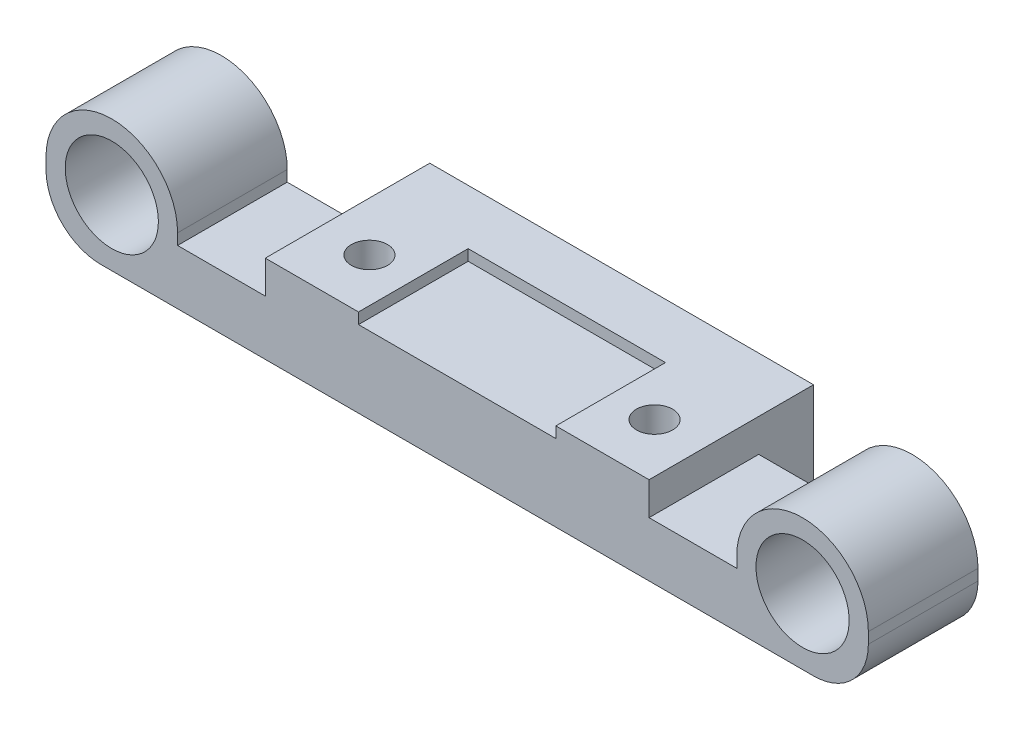
ISO-10303-21;
HEADER;
FILE_DESCRIPTION(('STEP AP214'),'2;1');
FILE_NAME('part.step','',(''),(''),'','','');
FILE_SCHEMA(('AUTOMOTIVE_DESIGN { 1 0 10303 214 1 1 1 1 }'));
ENDSEC;
DATA;
#1=APPLICATION_CONTEXT('core data for automotive mechanical design processes');
#2=APPLICATION_PROTOCOL_DEFINITION('international standard','automotive_design',2000,#1);
#3=PRODUCT_CONTEXT('',#1,'mechanical');
#4=PRODUCT('Part','Part','',(#3));
#5=PRODUCT_RELATED_PRODUCT_CATEGORY('part','',(#4));
#6=PRODUCT_DEFINITION_FORMATION('','',#4);
#7=PRODUCT_DEFINITION_CONTEXT('part definition',#1,'design');
#8=PRODUCT_DEFINITION('design','',#6,#7);
#9=PRODUCT_DEFINITION_SHAPE('','',#8);
#10=(LENGTH_UNIT() NAMED_UNIT(*) SI_UNIT(.MILLI.,.METRE.));
#11=(NAMED_UNIT(*) PLANE_ANGLE_UNIT() SI_UNIT($,.RADIAN.));
#12=(NAMED_UNIT(*) SI_UNIT($,.STERADIAN.) SOLID_ANGLE_UNIT());
#13=UNCERTAINTY_MEASURE_WITH_UNIT(LENGTH_MEASURE(1.E-05),#10,'distance_accuracy_value','');
#14=(GEOMETRIC_REPRESENTATION_CONTEXT(3) GLOBAL_UNCERTAINTY_ASSIGNED_CONTEXT((#13)) GLOBAL_UNIT_ASSIGNED_CONTEXT((#10,
#11,#12)) REPRESENTATION_CONTEXT('',''));
#15=CARTESIAN_POINT('',(0.,0.,0.));
#16=DIRECTION('',(0.,0.,1.));
#17=DIRECTION('',(1.,0.,0.));
#18=AXIS2_PLACEMENT_3D('',#15,#16,#17);
#19=CARTESIAN_POINT('',(17.5,8.,24.375));
#20=DIRECTION('',(-1.,0.,0.));
#21=DIRECTION('',(0.,0.,1.));
#22=AXIS2_PLACEMENT_3D('',#19,#20,#21);
#23=PLANE('',#22);
#24=DIRECTION('',(0.,0.,1.));
#25=VECTOR('',#24,1.);
#26=CARTESIAN_POINT('',(17.5,4.99999999999999,14.375));
#27=LINE('',#26,#25);
#28=CARTESIAN_POINT('',(17.5,4.99999999999999,14.375));
#29=VERTEX_POINT('',#28);
#30=CARTESIAN_POINT('',(17.5,4.99999999999999,24.375));
#31=VERTEX_POINT('',#30);
#32=EDGE_CURVE('E226',#29,#31,#27,.T.);
#33=ORIENTED_EDGE('',*,*,#32,.F.);
#34=DIRECTION('',(0.,-1.,0.));
#35=VECTOR('',#34,1.);
#36=CARTESIAN_POINT('',(17.5,4.99999999999999,14.375));
#37=LINE('',#36,#35);
#38=CARTESIAN_POINT('',(17.5,0.,14.375));
#39=VERTEX_POINT('',#38);
#40=EDGE_CURVE('E211',#29,#39,#37,.T.);
#41=ORIENTED_EDGE('',*,*,#40,.T.);
#42=DIRECTION('',(0.,0.,-1.));
#43=VECTOR('',#42,1.);
#44=CARTESIAN_POINT('',(17.5,0.,24.375));
#45=LINE('',#44,#43);
#46=CARTESIAN_POINT('',(17.5,0.,9.375));
#47=VERTEX_POINT('',#46);
#48=EDGE_CURVE('E331',#39,#47,#45,.T.);
#49=ORIENTED_EDGE('',*,*,#48,.T.);
#50=DIRECTION('',(0.,-1.,0.));
#51=VECTOR('',#50,1.);
#52=CARTESIAN_POINT('',(17.5,8.,9.375));
#53=LINE('',#52,#51);
#54=CARTESIAN_POINT('',(17.5,8.,9.375));
#55=VERTEX_POINT('',#54);
#56=EDGE_CURVE('E343',#55,#47,#53,.T.);
#57=ORIENTED_EDGE('',*,*,#56,.F.);
#58=DIRECTION('',(0.,0.,-1.));
#59=VECTOR('',#58,1.);
#60=CARTESIAN_POINT('',(17.5,8.,24.375));
#61=LINE('',#60,#59);
#62=CARTESIAN_POINT('',(17.5,8.,24.375));
#63=VERTEX_POINT('',#62);
#64=EDGE_CURVE('E320',#63,#55,#61,.T.);
#65=ORIENTED_EDGE('',*,*,#64,.F.);
#66=DIRECTION('',(0.,-1.,0.));
#67=VECTOR('',#66,1.);
#68=CARTESIAN_POINT('',(17.5,8.,24.375));
#69=LINE('',#68,#67);
#70=EDGE_CURVE('E340',#63,#31,#69,.T.);
#71=ORIENTED_EDGE('',*,*,#70,.T.);
#72=EDGE_LOOP('',(#33,#41,#49,#57,#65,#71));
#73=FACE_BOUND('',#72,.T.);
#74=ADVANCED_FACE('F39',(#73),#23,.F.);
#75=CARTESIAN_POINT('',(-17.5,8.,24.375));
#76=DIRECTION('',(-1.,0.,0.));
#77=DIRECTION('',(0.,0.,1.));
#78=AXIS2_PLACEMENT_3D('',#75,#76,#77);
#79=PLANE('',#78);
#80=DIRECTION('',(0.,0.,-1.));
#81=VECTOR('',#80,1.);
#82=CARTESIAN_POINT('',(-17.5,0.,24.375));
#83=LINE('',#82,#81);
#84=CARTESIAN_POINT('',(-17.5,0.,14.375));
#85=VERTEX_POINT('',#84);
#86=CARTESIAN_POINT('',(-17.5,0.,9.375));
#87=VERTEX_POINT('',#86);
#88=EDGE_CURVE('E303',#85,#87,#83,.T.);
#89=ORIENTED_EDGE('',*,*,#88,.F.);
#90=DIRECTION('',(0.,1.,0.));
#91=VECTOR('',#90,1.);
#92=CARTESIAN_POINT('',(-17.5,5.,14.375));
#93=LINE('',#92,#91);
#94=CARTESIAN_POINT('',(-17.5,5.,14.375));
#95=VERTEX_POINT('',#94);
#96=EDGE_CURVE('E229',#85,#95,#93,.T.);
#97=ORIENTED_EDGE('',*,*,#96,.T.);
#98=DIRECTION('',(0.,0.,1.));
#99=VECTOR('',#98,1.);
#100=CARTESIAN_POINT('',(-17.5,5.,14.375));
#101=LINE('',#100,#99);
#102=CARTESIAN_POINT('',(-17.5,5.,24.375));
#103=VERTEX_POINT('',#102);
#104=EDGE_CURVE('E246',#95,#103,#101,.T.);
#105=ORIENTED_EDGE('',*,*,#104,.T.);
#106=DIRECTION('',(0.,-1.,0.));
#107=VECTOR('',#106,1.);
#108=CARTESIAN_POINT('',(-17.5,8.,24.375));
#109=LINE('',#108,#107);
#110=CARTESIAN_POINT('',(-17.5,8.,24.375));
#111=VERTEX_POINT('',#110);
#112=EDGE_CURVE('E336',#111,#103,#109,.T.);
#113=ORIENTED_EDGE('',*,*,#112,.F.);
#114=DIRECTION('',(0.,0.,-1.));
#115=VECTOR('',#114,1.);
#116=CARTESIAN_POINT('',(-17.5,8.,24.375));
#117=LINE('',#116,#115);
#118=CARTESIAN_POINT('',(-17.5,8.,9.375));
#119=VERTEX_POINT('',#118);
#120=EDGE_CURVE('E314',#111,#119,#117,.T.);
#121=ORIENTED_EDGE('',*,*,#120,.T.);
#122=DIRECTION('',(0.,-1.,0.));
#123=VECTOR('',#122,1.);
#124=CARTESIAN_POINT('',(-17.5,8.,9.375));
#125=LINE('',#124,#123);
#126=EDGE_CURVE('E327',#119,#87,#125,.T.);
#127=ORIENTED_EDGE('',*,*,#126,.T.);
#128=EDGE_LOOP('',(#89,#97,#105,#113,#121,#127));
#129=FACE_BOUND('',#128,.T.);
#130=ADVANCED_FACE('F386',(#129),#79,.T.);
#131=CARTESIAN_POINT('',(0.,8.,0.));
#132=DIRECTION('',(0.,-1.,0.));
#133=DIRECTION('',(0.,0.,-1.));
#134=AXIS2_PLACEMENT_3D('',#131,#132,#133);
#135=PLANE('',#134);
#136=ORIENTED_EDGE('',*,*,#64,.T.);
#137=DIRECTION('',(1.,0.,0.));
#138=VECTOR('',#137,1.);
#139=CARTESIAN_POINT('',(-17.5,8.,9.375));
#140=LINE('',#139,#138);
#141=EDGE_CURVE('E317',#119,#55,#140,.T.);
#142=ORIENTED_EDGE('',*,*,#141,.F.);
#143=ORIENTED_EDGE('',*,*,#120,.F.);
#144=DIRECTION('',(1.,0.,0.));
#145=VECTOR('',#144,1.);
#146=CARTESIAN_POINT('',(-17.5,8.,24.375));
#147=LINE('',#146,#145);
#148=CARTESIAN_POINT('',(-9.,8.,24.375));
#149=VERTEX_POINT('',#148);
#150=EDGE_CURVE('E324',#111,#149,#147,.T.);
#151=ORIENTED_EDGE('',*,*,#150,.T.);
#152=DIRECTION('',(0.,0.,1.));
#153=VECTOR('',#152,1.);
#154=CARTESIAN_POINT('',(-9.,8.,14.375));
#155=LINE('',#154,#153);
#156=CARTESIAN_POINT('',(-9.,8.,14.375));
#157=VERTEX_POINT('',#156);
#158=EDGE_CURVE('E259',#157,#149,#155,.T.);
#159=ORIENTED_EDGE('',*,*,#158,.F.);
#160=DIRECTION('',(-1.,0.,0.));
#161=VECTOR('',#160,1.);
#162=CARTESIAN_POINT('',(-9.,8.,14.375));
#163=LINE('',#162,#161);
#164=CARTESIAN_POINT('',(9.,8.,14.375));
#165=VERTEX_POINT('',#164);
#166=EDGE_CURVE('E269',#165,#157,#163,.T.);
#167=ORIENTED_EDGE('',*,*,#166,.F.);
#168=DIRECTION('',(0.,0.,-1.));
#169=VECTOR('',#168,1.);
#170=CARTESIAN_POINT('',(9.,8.,14.375));
#171=LINE('',#170,#169);
#172=CARTESIAN_POINT('',(9.,8.,24.375));
#173=VERTEX_POINT('',#172);
#174=EDGE_CURVE('E280',#173,#165,#171,.T.);
#175=ORIENTED_EDGE('',*,*,#174,.F.);
#176=EDGE_CURVE('E323',#173,#63,#147,.T.);
#177=ORIENTED_EDGE('',*,*,#176,.T.);
#178=EDGE_LOOP('',(#136,#142,#143,#151,#159,#167,#175,#177));
#179=FACE_BOUND('',#178,.T.);
#180=CARTESIAN_POINT('',(-13.,8.,19.375));
#181=DIRECTION('',(0.,-1.,0.));
#182=DIRECTION('',(0.,0.,-1.));
#183=AXIS2_PLACEMENT_3D('',#180,#181,#182);
#184=CIRCLE('',#183,1.65);
#185=CARTESIAN_POINT('',(-13.,8.,17.725));
#186=VERTEX_POINT('',#185);
#187=EDGE_CURVE('E294',#186,#186,#184,.T.);
#188=ORIENTED_EDGE('',*,*,#187,.T.);
#189=EDGE_LOOP('',(#188));
#190=FACE_BOUND('',#189,.T.);
#191=CARTESIAN_POINT('',(13.,8.,19.375));
#192=DIRECTION('',(0.,-1.,0.));
#193=DIRECTION('',(0.,0.,-1.));
#194=AXIS2_PLACEMENT_3D('',#191,#192,#193);
#195=CIRCLE('',#194,1.65);
#196=CARTESIAN_POINT('',(13.,8.,17.725));
#197=VERTEX_POINT('',#196);
#198=EDGE_CURVE('E287',#197,#197,#195,.T.);
#199=ORIENTED_EDGE('',*,*,#198,.T.);
#200=EDGE_LOOP('',(#199));
#201=FACE_BOUND('',#200,.T.);
#202=ADVANCED_FACE('F406',(#179,#190,#201),#135,.F.);
#203=CARTESIAN_POINT('',(0.,0.,0.));
#204=DIRECTION('',(0.,-1.,0.));
#205=DIRECTION('',(0.,0.,-1.));
#206=AXIS2_PLACEMENT_3D('',#203,#204,#205);
#207=PLANE('',#206);
#208=DIRECTION('',(1.,0.,0.));
#209=VECTOR('',#208,1.);
#210=CARTESIAN_POINT('',(-17.5,0.,9.375));
#211=LINE('',#210,#209);
#212=EDGE_CURVE('E329',#87,#47,#211,.T.);
#213=ORIENTED_EDGE('',*,*,#212,.T.);
#214=ORIENTED_EDGE('',*,*,#48,.F.);
#215=DIRECTION('',(1.,0.,0.));
#216=VECTOR('',#215,1.);
#217=CARTESIAN_POINT('',(17.5,0.,14.375));
#218=LINE('',#217,#216);
#219=CARTESIAN_POINT('',(32.5,0.,14.375));
#220=VERTEX_POINT('',#219);
#221=EDGE_CURVE('E214',#39,#220,#218,.T.);
#222=ORIENTED_EDGE('',*,*,#221,.T.);
#223=DIRECTION('',(0.,0.,1.));
#224=VECTOR('',#223,1.);
#225=CARTESIAN_POINT('',(32.5,0.,0.));
#226=LINE('',#225,#224);
#227=CARTESIAN_POINT('',(32.5,0.,24.375));
#228=VERTEX_POINT('',#227);
#229=EDGE_CURVE('E353',#220,#228,#226,.T.);
#230=ORIENTED_EDGE('',*,*,#229,.T.);
#231=DIRECTION('',(1.,0.,0.));
#232=VECTOR('',#231,1.);
#233=CARTESIAN_POINT('',(-17.5,0.,24.375));
#234=LINE('',#233,#232);
#235=CARTESIAN_POINT('',(-32.5,0.,24.375));
#236=VERTEX_POINT('',#235);
#237=EDGE_CURVE('E318',#236,#228,#234,.T.);
#238=ORIENTED_EDGE('',*,*,#237,.F.);
#239=DIRECTION('',(0.,0.,1.));
#240=VECTOR('',#239,1.);
#241=CARTESIAN_POINT('',(-32.5,0.,0.));
#242=LINE('',#241,#240);
#243=CARTESIAN_POINT('',(-32.5,0.,14.375));
#244=VERTEX_POINT('',#243);
#245=EDGE_CURVE('E339',#236,#244,#242,.F.);
#246=ORIENTED_EDGE('',*,*,#245,.T.);
#247=DIRECTION('',(1.,0.,0.));
#248=VECTOR('',#247,1.);
#249=CARTESIAN_POINT('',(-17.5,0.,14.375));
#250=LINE('',#249,#248);
#251=EDGE_CURVE('E244',#244,#85,#250,.T.);
#252=ORIENTED_EDGE('',*,*,#251,.T.);
#253=ORIENTED_EDGE('',*,*,#88,.T.);
#254=EDGE_LOOP('',(#213,#214,#222,#230,#238,#246,#252,#253));
#255=FACE_BOUND('',#254,.T.);
#256=CARTESIAN_POINT('',(-13.,0.,19.375));
#257=DIRECTION('',(0.,-1.,0.));
#258=DIRECTION('',(0.,0.,-1.));
#259=AXIS2_PLACEMENT_3D('',#256,#257,#258);
#260=CIRCLE('',#259,3.);
#261=CARTESIAN_POINT('',(-13.,0.,16.375));
#262=VERTEX_POINT('',#261);
#263=EDGE_CURVE('E304',#262,#262,#260,.T.);
#264=ORIENTED_EDGE('',*,*,#263,.F.);
#265=EDGE_LOOP('',(#264));
#266=FACE_BOUND('',#265,.T.);
#267=CARTESIAN_POINT('',(13.,0.,19.375));
#268=DIRECTION('',(0.,-1.,0.));
#269=DIRECTION('',(0.,0.,-1.));
#270=AXIS2_PLACEMENT_3D('',#267,#268,#269);
#271=CIRCLE('',#270,3.);
#272=CARTESIAN_POINT('',(13.,0.,16.375));
#273=VERTEX_POINT('',#272);
#274=EDGE_CURVE('E307',#273,#273,#271,.T.);
#275=ORIENTED_EDGE('',*,*,#274,.F.);
#276=EDGE_LOOP('',(#275));
#277=FACE_BOUND('',#276,.T.);
#278=ADVANCED_FACE('F389',(#255,#266,#277),#207,.T.);
#279=CARTESIAN_POINT('',(-17.5,8.,24.375));
#280=DIRECTION('',(0.,0.,-1.));
#281=DIRECTION('',(-1.,0.,0.));
#282=AXIS2_PLACEMENT_3D('',#279,#280,#281);
#283=PLANE('',#282);
#284=CARTESIAN_POINT('',(-31.5,6.,24.375));
#285=DIRECTION('',(0.,0.,1.));
#286=DIRECTION('',(1.,0.,0.));
#287=AXIS2_PLACEMENT_3D('',#284,#285,#286);
#288=CIRCLE('',#287,4.25000000000001);
#289=CARTESIAN_POINT('',(-27.25,6.,24.375));
#290=VERTEX_POINT('',#289);
#291=EDGE_CURVE('E430',#290,#290,#288,.T.);
#292=ORIENTED_EDGE('',*,*,#291,.F.);
#293=EDGE_LOOP('',(#292));
#294=FACE_BOUND('',#293,.T.);
#295=CARTESIAN_POINT('',(31.5,6.,24.375));
#296=DIRECTION('',(0.,0.,1.));
#297=DIRECTION('',(-1.,0.,0.));
#298=AXIS2_PLACEMENT_3D('',#295,#296,#297);
#299=CIRCLE('',#298,4.25000000000001);
#300=CARTESIAN_POINT('',(27.25,6.,24.375));
#301=VERTEX_POINT('',#300);
#302=EDGE_CURVE('E207',#301,#301,#299,.T.);
#303=ORIENTED_EDGE('',*,*,#302,.F.);
#304=EDGE_LOOP('',(#303));
#305=FACE_BOUND('',#304,.T.);
#306=ORIENTED_EDGE('',*,*,#237,.T.);
#307=CARTESIAN_POINT('',(32.5,5.,24.375));
#308=DIRECTION('',(0.,0.,-1.));
#309=DIRECTION('',(-1.,0.,0.));
#310=AXIS2_PLACEMENT_3D('',#307,#308,#309);
#311=CIRCLE('',#310,5.);
#312=CARTESIAN_POINT('',(37.5,5.,24.375));
#313=VERTEX_POINT('',#312);
#314=EDGE_CURVE('E358',#228,#313,#311,.F.);
#315=ORIENTED_EDGE('',*,*,#314,.T.);
#316=DIRECTION('',(0.,1.,0.));
#317=VECTOR('',#316,1.);
#318=CARTESIAN_POINT('',(37.5,0.,24.375));
#319=LINE('',#318,#317);
#320=CARTESIAN_POINT('',(37.5,6.,24.375));
#321=VERTEX_POINT('',#320);
#322=EDGE_CURVE('E202',#313,#321,#319,.T.);
#323=ORIENTED_EDGE('',*,*,#322,.T.);
#324=CARTESIAN_POINT('',(31.5,6.,24.375));
#325=DIRECTION('',(0.,0.,1.));
#326=DIRECTION('',(1.,0.,0.));
#327=AXIS2_PLACEMENT_3D('',#324,#325,#326);
#328=CIRCLE('',#327,6.);
#329=CARTESIAN_POINT('',(25.5,6.,24.375));
#330=VERTEX_POINT('',#329);
#331=EDGE_CURVE('E218',#321,#330,#328,.T.);
#332=ORIENTED_EDGE('',*,*,#331,.T.);
#333=DIRECTION('',(0.,-1.,0.));
#334=VECTOR('',#333,1.);
#335=CARTESIAN_POINT('',(25.5,6.,24.375));
#336=LINE('',#335,#334);
#337=CARTESIAN_POINT('',(25.5,5.,24.375));
#338=VERTEX_POINT('',#337);
#339=EDGE_CURVE('E182',#330,#338,#336,.T.);
#340=ORIENTED_EDGE('',*,*,#339,.T.);
#341=DIRECTION('',(-1.,0.,0.));
#342=VECTOR('',#341,1.);
#343=CARTESIAN_POINT('',(25.5,5.,24.375));
#344=LINE('',#343,#342);
#345=EDGE_CURVE('E204',#338,#31,#344,.T.);
#346=ORIENTED_EDGE('',*,*,#345,.T.);
#347=ORIENTED_EDGE('',*,*,#70,.F.);
#348=ORIENTED_EDGE('',*,*,#176,.F.);
#349=DIRECTION('',(0.,1.,0.));
#350=VECTOR('',#349,1.);
#351=CARTESIAN_POINT('',(9.,7.,24.375));
#352=LINE('',#351,#350);
#353=CARTESIAN_POINT('',(9.,7.,24.375));
#354=VERTEX_POINT('',#353);
#355=EDGE_CURVE('E290',#354,#173,#352,.T.);
#356=ORIENTED_EDGE('',*,*,#355,.F.);
#357=DIRECTION('',(1.,0.,0.));
#358=VECTOR('',#357,1.);
#359=CARTESIAN_POINT('',(-9.,7.,24.375));
#360=LINE('',#359,#358);
#361=CARTESIAN_POINT('',(-9.,7.,24.375));
#362=VERTEX_POINT('',#361);
#363=EDGE_CURVE('E268',#362,#354,#360,.T.);
#364=ORIENTED_EDGE('',*,*,#363,.F.);
#365=DIRECTION('',(0.,1.,0.));
#366=VECTOR('',#365,1.);
#367=CARTESIAN_POINT('',(-9.,7.,24.375));
#368=LINE('',#367,#366);
#369=EDGE_CURVE('E278',#362,#149,#368,.T.);
#370=ORIENTED_EDGE('',*,*,#369,.T.);
#371=ORIENTED_EDGE('',*,*,#150,.F.);
#372=ORIENTED_EDGE('',*,*,#112,.T.);
#373=DIRECTION('',(-1.,0.,0.));
#374=VECTOR('',#373,1.);
#375=CARTESIAN_POINT('',(-25.5,5.,24.375));
#376=LINE('',#375,#374);
#377=CARTESIAN_POINT('',(-25.5,5.,24.375));
#378=VERTEX_POINT('',#377);
#379=EDGE_CURVE('E225',#103,#378,#376,.T.);
#380=ORIENTED_EDGE('',*,*,#379,.T.);
#381=DIRECTION('',(0.,1.,0.));
#382=VECTOR('',#381,1.);
#383=CARTESIAN_POINT('',(-25.5,6.,24.375));
#384=LINE('',#383,#382);
#385=CARTESIAN_POINT('',(-25.5,6.,24.375));
#386=VERTEX_POINT('',#385);
#387=EDGE_CURVE('E249',#378,#386,#384,.T.);
#388=ORIENTED_EDGE('',*,*,#387,.T.);
#389=CARTESIAN_POINT('',(-31.5,6.,24.375));
#390=DIRECTION('',(0.,0.,1.));
#391=DIRECTION('',(-1.,0.,0.));
#392=AXIS2_PLACEMENT_3D('',#389,#390,#391);
#393=CIRCLE('',#392,6.);
#394=CARTESIAN_POINT('',(-37.5,6.,24.375));
#395=VERTEX_POINT('',#394);
#396=EDGE_CURVE('E252',#386,#395,#393,.T.);
#397=ORIENTED_EDGE('',*,*,#396,.T.);
#398=DIRECTION('',(0.,-1.,0.));
#399=VECTOR('',#398,1.);
#400=CARTESIAN_POINT('',(-37.5,0.,24.375));
#401=LINE('',#400,#399);
#402=CARTESIAN_POINT('',(-37.5,5.,24.375));
#403=VERTEX_POINT('',#402);
#404=EDGE_CURVE('E233',#395,#403,#401,.T.);
#405=ORIENTED_EDGE('',*,*,#404,.T.);
#406=CARTESIAN_POINT('',(-32.5,5.,24.375));
#407=DIRECTION('',(0.,0.,-1.));
#408=DIRECTION('',(-1.,0.,0.));
#409=AXIS2_PLACEMENT_3D('',#406,#407,#408);
#410=CIRCLE('',#409,5.);
#411=EDGE_CURVE('E356',#403,#236,#410,.F.);
#412=ORIENTED_EDGE('',*,*,#411,.T.);
#413=EDGE_LOOP('',(#306,#315,#323,#332,#340,#346,#347,#348,#356,#364,#370,#371,#372,#380,#388,
#397,#405,#412));
#414=FACE_BOUND('',#413,.T.);
#415=ADVANCED_FACE('F369',(#294,#305,#414),#283,.F.);
#416=CARTESIAN_POINT('',(4.,8.,9.375));
#417=DIRECTION('',(0.,0.,-1.));
#418=DIRECTION('',(-1.,0.,0.));
#419=AXIS2_PLACEMENT_3D('',#416,#417,#418);
#420=PLANE('',#419);
#421=ORIENTED_EDGE('',*,*,#56,.T.);
#422=ORIENTED_EDGE('',*,*,#212,.F.);
#423=ORIENTED_EDGE('',*,*,#126,.F.);
#424=ORIENTED_EDGE('',*,*,#141,.T.);
#425=EDGE_LOOP('',(#421,#422,#423,#424));
#426=FACE_BOUND('',#425,.T.);
#427=ADVANCED_FACE('F412',(#426),#420,.T.);
#428=CARTESIAN_POINT('',(13.,3.,19.375));
#429=DIRECTION('',(0.,-1.,0.));
#430=DIRECTION('',(0.,0.,-1.));
#431=AXIS2_PLACEMENT_3D('',#428,#429,#430);
#432=CYLINDRICAL_SURFACE('',#431,3.);
#433=CARTESIAN_POINT('',(13.,3.,19.375));
#434=DIRECTION('',(0.,-1.,0.));
#435=DIRECTION('',(0.,0.,-1.));
#436=AXIS2_PLACEMENT_3D('',#433,#434,#435);
#437=CIRCLE('',#436,3.);
#438=CARTESIAN_POINT('',(13.,3.,16.375));
#439=VERTEX_POINT('',#438);
#440=EDGE_CURVE('E310',#439,#439,#437,.T.);
#441=ORIENTED_EDGE('',*,*,#440,.F.);
#442=EDGE_LOOP('',(#441));
#443=FACE_BOUND('',#442,.T.);
#444=ORIENTED_EDGE('',*,*,#274,.T.);
#445=EDGE_LOOP('',(#444));
#446=FACE_BOUND('',#445,.T.);
#447=ADVANCED_FACE('F414',(#443,#446),#432,.F.);
#448=CARTESIAN_POINT('',(13.,3.,19.375));
#449=DIRECTION('',(0.,-1.,0.));
#450=DIRECTION('',(0.,0.,-1.));
#451=AXIS2_PLACEMENT_3D('',#448,#449,#450);
#452=PLANE('',#451);
#453=CARTESIAN_POINT('',(13.,3.,19.375));
#454=DIRECTION('',(0.,-1.,0.));
#455=DIRECTION('',(0.,0.,-1.));
#456=AXIS2_PLACEMENT_3D('',#453,#454,#455);
#457=CIRCLE('',#456,1.65);
#458=CARTESIAN_POINT('',(13.,3.,17.725));
#459=VERTEX_POINT('',#458);
#460=EDGE_CURVE('E313',#459,#459,#457,.T.);
#461=ORIENTED_EDGE('',*,*,#460,.F.);
#462=EDGE_LOOP('',(#461));
#463=FACE_BOUND('',#462,.T.);
#464=ORIENTED_EDGE('',*,*,#440,.T.);
#465=EDGE_LOOP('',(#464));
#466=FACE_BOUND('',#465,.T.);
#467=ADVANCED_FACE('F514',(#463,#466),#452,.T.);
#468=CARTESIAN_POINT('',(-13.,3.,19.375));
#469=DIRECTION('',(0.,-1.,0.));
#470=DIRECTION('',(0.,0.,-1.));
#471=AXIS2_PLACEMENT_3D('',#468,#469,#470);
#472=CYLINDRICAL_SURFACE('',#471,3.);
#473=CARTESIAN_POINT('',(-13.,3.,19.375));
#474=DIRECTION('',(0.,-1.,0.));
#475=DIRECTION('',(0.,0.,-1.));
#476=AXIS2_PLACEMENT_3D('',#473,#474,#475);
#477=CIRCLE('',#476,3.);
#478=CARTESIAN_POINT('',(-13.,3.,16.375));
#479=VERTEX_POINT('',#478);
#480=EDGE_CURVE('E300',#479,#479,#477,.T.);
#481=ORIENTED_EDGE('',*,*,#480,.F.);
#482=EDGE_LOOP('',(#481));
#483=FACE_BOUND('',#482,.T.);
#484=ORIENTED_EDGE('',*,*,#263,.T.);
#485=EDGE_LOOP('',(#484));
#486=FACE_BOUND('',#485,.T.);
#487=ADVANCED_FACE('F510',(#483,#486),#472,.F.);
#488=CARTESIAN_POINT('',(-13.,3.,19.375));
#489=DIRECTION('',(0.,-1.,0.));
#490=DIRECTION('',(0.,0.,-1.));
#491=AXIS2_PLACEMENT_3D('',#488,#489,#490);
#492=PLANE('',#491);
#493=CARTESIAN_POINT('',(-13.,3.,19.375));
#494=DIRECTION('',(0.,-1.,0.));
#495=DIRECTION('',(0.,0.,-1.));
#496=AXIS2_PLACEMENT_3D('',#493,#494,#495);
#497=CIRCLE('',#496,1.65);
#498=CARTESIAN_POINT('',(-13.,3.,17.725));
#499=VERTEX_POINT('',#498);
#500=EDGE_CURVE('E297',#499,#499,#497,.T.);
#501=ORIENTED_EDGE('',*,*,#500,.F.);
#502=EDGE_LOOP('',(#501));
#503=FACE_BOUND('',#502,.T.);
#504=ORIENTED_EDGE('',*,*,#480,.T.);
#505=EDGE_LOOP('',(#504));
#506=FACE_BOUND('',#505,.T.);
#507=ADVANCED_FACE('F503',(#503,#506),#492,.T.);
#508=CARTESIAN_POINT('',(-13.,8.,19.375));
#509=DIRECTION('',(0.,-1.,0.));
#510=DIRECTION('',(0.,0.,-1.));
#511=AXIS2_PLACEMENT_3D('',#508,#509,#510);
#512=CYLINDRICAL_SURFACE('',#511,1.65);
#513=ORIENTED_EDGE('',*,*,#500,.T.);
#514=EDGE_LOOP('',(#513));
#515=FACE_BOUND('',#514,.T.);
#516=ORIENTED_EDGE('',*,*,#187,.F.);
#517=EDGE_LOOP('',(#516));
#518=FACE_BOUND('',#517,.T.);
#519=ADVANCED_FACE('F500',(#515,#518),#512,.F.);
#520=CARTESIAN_POINT('',(13.,8.,19.375));
#521=DIRECTION('',(0.,-1.,0.));
#522=DIRECTION('',(0.,0.,-1.));
#523=AXIS2_PLACEMENT_3D('',#520,#521,#522);
#524=CYLINDRICAL_SURFACE('',#523,1.65);
#525=ORIENTED_EDGE('',*,*,#460,.T.);
#526=EDGE_LOOP('',(#525));
#527=FACE_BOUND('',#526,.T.);
#528=ORIENTED_EDGE('',*,*,#198,.F.);
#529=EDGE_LOOP('',(#528));
#530=FACE_BOUND('',#529,.T.);
#531=ADVANCED_FACE('F498',(#527,#530),#524,.F.);
#532=CARTESIAN_POINT('',(-9.,7.,14.375));
#533=DIRECTION('',(-1.,0.,0.));
#534=DIRECTION('',(0.,0.,1.));
#535=AXIS2_PLACEMENT_3D('',#532,#533,#534);
#536=PLANE('',#535);
#537=ORIENTED_EDGE('',*,*,#158,.T.);
#538=ORIENTED_EDGE('',*,*,#369,.F.);
#539=DIRECTION('',(0.,0.,1.));
#540=VECTOR('',#539,1.);
#541=CARTESIAN_POINT('',(-9.,7.,14.375));
#542=LINE('',#541,#540);
#543=CARTESIAN_POINT('',(-9.,7.,14.375));
#544=VERTEX_POINT('',#543);
#545=EDGE_CURVE('E266',#544,#362,#542,.T.);
#546=ORIENTED_EDGE('',*,*,#545,.F.);
#547=DIRECTION('',(0.,1.,0.));
#548=VECTOR('',#547,1.);
#549=CARTESIAN_POINT('',(-9.,7.,14.375));
#550=LINE('',#549,#548);
#551=EDGE_CURVE('E285',#544,#157,#550,.T.);
#552=ORIENTED_EDGE('',*,*,#551,.T.);
#553=EDGE_LOOP('',(#537,#538,#546,#552));
#554=FACE_BOUND('',#553,.T.);
#555=ADVANCED_FACE('F491',(#554),#536,.F.);
#556=CARTESIAN_POINT('',(-9.,7.,14.375));
#557=DIRECTION('',(0.,0.,-1.));
#558=DIRECTION('',(-1.,0.,0.));
#559=AXIS2_PLACEMENT_3D('',#556,#557,#558);
#560=PLANE('',#559);
#561=ORIENTED_EDGE('',*,*,#166,.T.);
#562=ORIENTED_EDGE('',*,*,#551,.F.);
#563=DIRECTION('',(-1.,0.,0.));
#564=VECTOR('',#563,1.);
#565=CARTESIAN_POINT('',(-9.,7.,14.375));
#566=LINE('',#565,#564);
#567=CARTESIAN_POINT('',(9.,7.,14.375));
#568=VERTEX_POINT('',#567);
#569=EDGE_CURVE('E275',#568,#544,#566,.T.);
#570=ORIENTED_EDGE('',*,*,#569,.F.);
#571=DIRECTION('',(0.,1.,0.));
#572=VECTOR('',#571,1.);
#573=CARTESIAN_POINT('',(9.,7.,14.375));
#574=LINE('',#573,#572);
#575=EDGE_CURVE('E288',#568,#165,#574,.T.);
#576=ORIENTED_EDGE('',*,*,#575,.T.);
#577=EDGE_LOOP('',(#561,#562,#570,#576));
#578=FACE_BOUND('',#577,.T.);
#579=ADVANCED_FACE('F488',(#578),#560,.F.);
#580=CARTESIAN_POINT('',(9.,7.,14.375));
#581=DIRECTION('',(1.,0.,0.));
#582=DIRECTION('',(0.,0.,-1.));
#583=AXIS2_PLACEMENT_3D('',#580,#581,#582);
#584=PLANE('',#583);
#585=ORIENTED_EDGE('',*,*,#174,.T.);
#586=ORIENTED_EDGE('',*,*,#575,.F.);
#587=DIRECTION('',(0.,0.,-1.));
#588=VECTOR('',#587,1.);
#589=CARTESIAN_POINT('',(9.,7.,14.375));
#590=LINE('',#589,#588);
#591=EDGE_CURVE('E272',#354,#568,#590,.T.);
#592=ORIENTED_EDGE('',*,*,#591,.F.);
#593=ORIENTED_EDGE('',*,*,#355,.T.);
#594=EDGE_LOOP('',(#585,#586,#592,#593));
#595=FACE_BOUND('',#594,.T.);
#596=ADVANCED_FACE('F486',(#595),#584,.F.);
#597=CARTESIAN_POINT('',(0.,7.,0.));
#598=DIRECTION('',(0.,1.,0.));
#599=DIRECTION('',(0.,0.,1.));
#600=AXIS2_PLACEMENT_3D('',#597,#598,#599);
#601=PLANE('',#600);
#602=ORIENTED_EDGE('',*,*,#545,.T.);
#603=ORIENTED_EDGE('',*,*,#363,.T.);
#604=ORIENTED_EDGE('',*,*,#591,.T.);
#605=ORIENTED_EDGE('',*,*,#569,.T.);
#606=EDGE_LOOP('',(#602,#603,#604,#605));
#607=FACE_BOUND('',#606,.T.);
#608=ADVANCED_FACE('F477',(#607),#601,.T.);
#609=CARTESIAN_POINT('',(-37.5,0.,14.375));
#610=DIRECTION('',(-1.,0.,0.));
#611=DIRECTION('',(0.,0.,1.));
#612=AXIS2_PLACEMENT_3D('',#609,#610,#611);
#613=PLANE('',#612);
#614=DIRECTION('',(0.,-1.,0.));
#615=VECTOR('',#614,1.);
#616=CARTESIAN_POINT('',(-37.5,0.,14.375));
#617=LINE('',#616,#615);
#618=CARTESIAN_POINT('',(-37.5,6.,14.375));
#619=VERTEX_POINT('',#618);
#620=CARTESIAN_POINT('',(-37.5,5.,14.375));
#621=VERTEX_POINT('',#620);
#622=EDGE_CURVE('E242',#619,#621,#617,.T.);
#623=ORIENTED_EDGE('',*,*,#622,.T.);
#624=DIRECTION('',(0.,0.,1.));
#625=VECTOR('',#624,1.);
#626=CARTESIAN_POINT('',(-37.5,5.,14.375));
#627=LINE('',#626,#625);
#628=EDGE_CURVE('E47',#621,#403,#627,.T.);
#629=ORIENTED_EDGE('',*,*,#628,.T.);
#630=ORIENTED_EDGE('',*,*,#404,.F.);
#631=DIRECTION('',(0.,0.,1.));
#632=VECTOR('',#631,1.);
#633=CARTESIAN_POINT('',(-37.5,6.,14.375));
#634=LINE('',#633,#632);
#635=EDGE_CURVE('E257',#619,#395,#634,.T.);
#636=ORIENTED_EDGE('',*,*,#635,.F.);
#637=EDGE_LOOP('',(#623,#629,#630,#636));
#638=FACE_BOUND('',#637,.T.);
#639=ADVANCED_FACE('F366',(#638),#613,.T.);
#640=CARTESIAN_POINT('',(-31.5,6.,14.375));
#641=DIRECTION('',(0.,0.,1.));
#642=DIRECTION('',(1.,0.,0.));
#643=AXIS2_PLACEMENT_3D('',#640,#641,#642);
#644=CYLINDRICAL_SURFACE('',#643,6.);
#645=ORIENTED_EDGE('',*,*,#396,.F.);
#646=DIRECTION('',(0.,0.,1.));
#647=VECTOR('',#646,1.);
#648=CARTESIAN_POINT('',(-25.5,6.,14.375));
#649=LINE('',#648,#647);
#650=CARTESIAN_POINT('',(-25.5,6.,14.375));
#651=VERTEX_POINT('',#650);
#652=EDGE_CURVE('E260',#651,#386,#649,.T.);
#653=ORIENTED_EDGE('',*,*,#652,.F.);
#654=CARTESIAN_POINT('',(-31.5,6.,14.375));
#655=DIRECTION('',(0.,0.,1.));
#656=DIRECTION('',(-1.,0.,0.));
#657=AXIS2_PLACEMENT_3D('',#654,#655,#656);
#658=CIRCLE('',#657,6.);
#659=EDGE_CURVE('E239',#651,#619,#658,.T.);
#660=ORIENTED_EDGE('',*,*,#659,.T.);
#661=ORIENTED_EDGE('',*,*,#635,.T.);
#662=EDGE_LOOP('',(#645,#653,#660,#661));
#663=FACE_BOUND('',#662,.T.);
#664=ADVANCED_FACE('F374',(#663),#644,.T.);
#665=CARTESIAN_POINT('',(-25.5,6.,14.375));
#666=DIRECTION('',(1.,0.,0.));
#667=DIRECTION('',(0.,0.,-1.));
#668=AXIS2_PLACEMENT_3D('',#665,#666,#667);
#669=PLANE('',#668);
#670=ORIENTED_EDGE('',*,*,#387,.F.);
#671=DIRECTION('',(0.,0.,1.));
#672=VECTOR('',#671,1.);
#673=CARTESIAN_POINT('',(-25.5,5.,14.375));
#674=LINE('',#673,#672);
#675=CARTESIAN_POINT('',(-25.5,5.,14.375));
#676=VERTEX_POINT('',#675);
#677=EDGE_CURVE('E262',#676,#378,#674,.T.);
#678=ORIENTED_EDGE('',*,*,#677,.F.);
#679=DIRECTION('',(0.,1.,0.));
#680=VECTOR('',#679,1.);
#681=CARTESIAN_POINT('',(-25.5,6.,14.375));
#682=LINE('',#681,#680);
#683=EDGE_CURVE('E236',#676,#651,#682,.T.);
#684=ORIENTED_EDGE('',*,*,#683,.T.);
#685=ORIENTED_EDGE('',*,*,#652,.T.);
#686=EDGE_LOOP('',(#670,#678,#684,#685));
#687=FACE_BOUND('',#686,.T.);
#688=ADVANCED_FACE('F380',(#687),#669,.T.);
#689=CARTESIAN_POINT('',(-25.5,5.,14.375));
#690=DIRECTION('',(0.,1.,0.));
#691=DIRECTION('',(-1.,0.,0.));
#692=AXIS2_PLACEMENT_3D('',#689,#690,#691);
#693=PLANE('',#692);
#694=ORIENTED_EDGE('',*,*,#379,.F.);
#695=ORIENTED_EDGE('',*,*,#104,.F.);
#696=DIRECTION('',(-1.,0.,0.));
#697=VECTOR('',#696,1.);
#698=CARTESIAN_POINT('',(-25.5,5.,14.375));
#699=LINE('',#698,#697);
#700=EDGE_CURVE('E232',#95,#676,#699,.T.);
#701=ORIENTED_EDGE('',*,*,#700,.T.);
#702=ORIENTED_EDGE('',*,*,#677,.T.);
#703=EDGE_LOOP('',(#694,#695,#701,#702));
#704=FACE_BOUND('',#703,.T.);
#705=ADVANCED_FACE('F382',(#704),#693,.T.);
#706=CARTESIAN_POINT('',(-31.5,6.,14.375));
#707=DIRECTION('',(0.,0.,-1.));
#708=DIRECTION('',(-1.,0.,0.));
#709=AXIS2_PLACEMENT_3D('',#706,#707,#708);
#710=PLANE('',#709);
#711=ORIENTED_EDGE('',*,*,#251,.F.);
#712=CARTESIAN_POINT('',(-32.5,5.,14.375));
#713=DIRECTION('',(0.,0.,-1.));
#714=DIRECTION('',(-1.,0.,0.));
#715=AXIS2_PLACEMENT_3D('',#712,#713,#714);
#716=CIRCLE('',#715,5.);
#717=EDGE_CURVE('E11',#244,#621,#716,.T.);
#718=ORIENTED_EDGE('',*,*,#717,.T.);
#719=ORIENTED_EDGE('',*,*,#622,.F.);
#720=ORIENTED_EDGE('',*,*,#659,.F.);
#721=ORIENTED_EDGE('',*,*,#683,.F.);
#722=ORIENTED_EDGE('',*,*,#700,.F.);
#723=ORIENTED_EDGE('',*,*,#96,.F.);
#724=EDGE_LOOP('',(#711,#718,#719,#720,#721,#722,#723));
#725=FACE_BOUND('',#724,.T.);
#726=ADVANCED_FACE('F376',(#725),#710,.T.);
#727=CARTESIAN_POINT('',(31.5,6.,14.375));
#728=DIRECTION('',(0.,0.,1.));
#729=DIRECTION('',(1.,0.,0.));
#730=AXIS2_PLACEMENT_3D('',#727,#728,#729);
#731=CYLINDRICAL_SURFACE('',#730,6.);
#732=ORIENTED_EDGE('',*,*,#331,.F.);
#733=DIRECTION('',(0.,0.,1.));
#734=VECTOR('',#733,1.);
#735=CARTESIAN_POINT('',(37.5,6.,14.375));
#736=LINE('',#735,#734);
#737=CARTESIAN_POINT('',(37.5,6.,14.375));
#738=VERTEX_POINT('',#737);
#739=EDGE_CURVE('E201',#738,#321,#736,.T.);
#740=ORIENTED_EDGE('',*,*,#739,.F.);
#741=CARTESIAN_POINT('',(31.5,6.,14.375));
#742=DIRECTION('',(0.,0.,1.));
#743=DIRECTION('',(1.,0.,0.));
#744=AXIS2_PLACEMENT_3D('',#741,#742,#743);
#745=CIRCLE('',#744,6.);
#746=CARTESIAN_POINT('',(25.5,6.,14.375));
#747=VERTEX_POINT('',#746);
#748=EDGE_CURVE('E194',#738,#747,#745,.T.);
#749=ORIENTED_EDGE('',*,*,#748,.T.);
#750=DIRECTION('',(0.,0.,1.));
#751=VECTOR('',#750,1.);
#752=CARTESIAN_POINT('',(25.5,6.,14.375));
#753=LINE('',#752,#751);
#754=EDGE_CURVE('E177',#747,#330,#753,.T.);
#755=ORIENTED_EDGE('',*,*,#754,.T.);
#756=EDGE_LOOP('',(#732,#740,#749,#755));
#757=FACE_BOUND('',#756,.T.);
#758=ADVANCED_FACE('F199',(#757),#731,.T.);
#759=CARTESIAN_POINT('',(37.5,0.,14.375));
#760=DIRECTION('',(1.,0.,0.));
#761=DIRECTION('',(0.,0.,-1.));
#762=AXIS2_PLACEMENT_3D('',#759,#760,#761);
#763=PLANE('',#762);
#764=ORIENTED_EDGE('',*,*,#322,.F.);
#765=DIRECTION('',(0.,0.,1.));
#766=VECTOR('',#765,1.);
#767=CARTESIAN_POINT('',(37.5,5.,14.375));
#768=LINE('',#767,#766);
#769=CARTESIAN_POINT('',(37.5,5.,14.375));
#770=VERTEX_POINT('',#769);
#771=EDGE_CURVE('E60',#313,#770,#768,.F.);
#772=ORIENTED_EDGE('',*,*,#771,.T.);
#773=DIRECTION('',(0.,1.,0.));
#774=VECTOR('',#773,1.);
#775=CARTESIAN_POINT('',(37.5,0.,14.375));
#776=LINE('',#775,#774);
#777=EDGE_CURVE('E188',#770,#738,#776,.T.);
#778=ORIENTED_EDGE('',*,*,#777,.T.);
#779=ORIENTED_EDGE('',*,*,#739,.T.);
#780=EDGE_LOOP('',(#764,#772,#778,#779));
#781=FACE_BOUND('',#780,.T.);
#782=ADVANCED_FACE('F462',(#781),#763,.T.);
#783=CARTESIAN_POINT('',(25.5,5.,14.375));
#784=DIRECTION('',(0.,1.,0.));
#785=DIRECTION('',(-1.,0.,0.));
#786=AXIS2_PLACEMENT_3D('',#783,#784,#785);
#787=PLANE('',#786);
#788=ORIENTED_EDGE('',*,*,#345,.F.);
#789=DIRECTION('',(0.,0.,1.));
#790=VECTOR('',#789,1.);
#791=CARTESIAN_POINT('',(25.5,5.,14.375));
#792=LINE('',#791,#790);
#793=CARTESIAN_POINT('',(25.5,5.,14.375));
#794=VERTEX_POINT('',#793);
#795=EDGE_CURVE('E187',#794,#338,#792,.T.);
#796=ORIENTED_EDGE('',*,*,#795,.F.);
#797=DIRECTION('',(-1.,0.,0.));
#798=VECTOR('',#797,1.);
#799=CARTESIAN_POINT('',(25.5,5.,14.375));
#800=LINE('',#799,#798);
#801=EDGE_CURVE('E196',#794,#29,#800,.T.);
#802=ORIENTED_EDGE('',*,*,#801,.T.);
#803=ORIENTED_EDGE('',*,*,#32,.T.);
#804=EDGE_LOOP('',(#788,#796,#802,#803));
#805=FACE_BOUND('',#804,.T.);
#806=ADVANCED_FACE('F465',(#805),#787,.T.);
#807=CARTESIAN_POINT('',(25.5,6.,14.375));
#808=DIRECTION('',(-1.,0.,0.));
#809=DIRECTION('',(0.,0.,1.));
#810=AXIS2_PLACEMENT_3D('',#807,#808,#809);
#811=PLANE('',#810);
#812=ORIENTED_EDGE('',*,*,#339,.F.);
#813=ORIENTED_EDGE('',*,*,#754,.F.);
#814=DIRECTION('',(0.,-1.,0.));
#815=VECTOR('',#814,1.);
#816=CARTESIAN_POINT('',(25.5,6.,14.375));
#817=LINE('',#816,#815);
#818=EDGE_CURVE('E180',#747,#794,#817,.T.);
#819=ORIENTED_EDGE('',*,*,#818,.T.);
#820=ORIENTED_EDGE('',*,*,#795,.T.);
#821=EDGE_LOOP('',(#812,#813,#819,#820));
#822=FACE_BOUND('',#821,.T.);
#823=ADVANCED_FACE('F179',(#822),#811,.T.);
#824=CARTESIAN_POINT('',(31.5,6.,14.375));
#825=DIRECTION('',(0.,0.,1.));
#826=DIRECTION('',(1.,0.,0.));
#827=AXIS2_PLACEMENT_3D('',#824,#825,#826);
#828=PLANE('',#827);
#829=ORIENTED_EDGE('',*,*,#777,.F.);
#830=CARTESIAN_POINT('',(32.5,5.,14.375));
#831=DIRECTION('',(0.,0.,1.));
#832=DIRECTION('',(1.,0.,0.));
#833=AXIS2_PLACEMENT_3D('',#830,#831,#832);
#834=CIRCLE('',#833,5.);
#835=EDGE_CURVE('E361',#770,#220,#834,.F.);
#836=ORIENTED_EDGE('',*,*,#835,.T.);
#837=ORIENTED_EDGE('',*,*,#221,.F.);
#838=ORIENTED_EDGE('',*,*,#40,.F.);
#839=ORIENTED_EDGE('',*,*,#801,.F.);
#840=ORIENTED_EDGE('',*,*,#818,.F.);
#841=ORIENTED_EDGE('',*,*,#748,.F.);
#842=EDGE_LOOP('',(#829,#836,#837,#838,#839,#840,#841));
#843=FACE_BOUND('',#842,.T.);
#844=ADVANCED_FACE('F193',(#843),#828,.F.);
#845=CARTESIAN_POINT('',(31.5,6.,16.375));
#846=DIRECTION('',(0.,0.,1.));
#847=DIRECTION('',(1.,0.,0.));
#848=AXIS2_PLACEMENT_3D('',#845,#846,#847);
#849=CYLINDRICAL_SURFACE('',#848,4.25000000000001);
#850=CARTESIAN_POINT('',(31.5,6.,16.375));
#851=DIRECTION('',(0.,0.,1.));
#852=DIRECTION('',(-1.,0.,0.));
#853=AXIS2_PLACEMENT_3D('',#850,#851,#852);
#854=CIRCLE('',#853,4.25000000000001);
#855=CARTESIAN_POINT('',(27.25,6.,16.375));
#856=VERTEX_POINT('',#855);
#857=EDGE_CURVE('E434',#856,#856,#854,.T.);
#858=ORIENTED_EDGE('',*,*,#857,.F.);
#859=EDGE_LOOP('',(#858));
#860=FACE_BOUND('',#859,.T.);
#861=ORIENTED_EDGE('',*,*,#302,.T.);
#862=EDGE_LOOP('',(#861));
#863=FACE_BOUND('',#862,.T.);
#864=ADVANCED_FACE('F454',(#860,#863),#849,.F.);
#865=CARTESIAN_POINT('',(31.5,6.,16.375));
#866=DIRECTION('',(0.,0.,-1.));
#867=DIRECTION('',(-1.,0.,0.));
#868=AXIS2_PLACEMENT_3D('',#865,#866,#867);
#869=PLANE('',#868);
#870=ORIENTED_EDGE('',*,*,#857,.T.);
#871=EDGE_LOOP('',(#870));
#872=FACE_BOUND('',#871,.T.);
#873=ADVANCED_FACE('F447',(#872),#869,.F.);
#874=CARTESIAN_POINT('',(-31.5,6.,16.375));
#875=DIRECTION('',(0.,0.,1.));
#876=DIRECTION('',(1.,0.,0.));
#877=AXIS2_PLACEMENT_3D('',#874,#875,#876);
#878=CYLINDRICAL_SURFACE('',#877,4.25000000000001);
#879=CARTESIAN_POINT('',(-31.5,6.,16.375));
#880=DIRECTION('',(0.,0.,1.));
#881=DIRECTION('',(1.,0.,0.));
#882=AXIS2_PLACEMENT_3D('',#879,#880,#881);
#883=CIRCLE('',#882,4.25000000000001);
#884=CARTESIAN_POINT('',(-27.25,6.,16.375));
#885=VERTEX_POINT('',#884);
#886=EDGE_CURVE('E220',#885,#885,#883,.T.);
#887=ORIENTED_EDGE('',*,*,#886,.F.);
#888=EDGE_LOOP('',(#887));
#889=FACE_BOUND('',#888,.T.);
#890=ORIENTED_EDGE('',*,*,#291,.T.);
#891=EDGE_LOOP('',(#890));
#892=FACE_BOUND('',#891,.T.);
#893=ADVANCED_FACE('F444',(#889,#892),#878,.F.);
#894=CARTESIAN_POINT('',(-31.5,6.,16.375));
#895=DIRECTION('',(0.,0.,1.));
#896=DIRECTION('',(1.,0.,0.));
#897=AXIS2_PLACEMENT_3D('',#894,#895,#896);
#898=PLANE('',#897);
#899=ORIENTED_EDGE('',*,*,#886,.T.);
#900=EDGE_LOOP('',(#899));
#901=FACE_BOUND('',#900,.T.);
#902=ADVANCED_FACE('F398',(#901),#898,.T.);
#903=CARTESIAN_POINT('',(32.5,5.,0.));
#904=DIRECTION('',(0.,0.,1.));
#905=DIRECTION('',(1.,0.,0.));
#906=AXIS2_PLACEMENT_3D('',#903,#904,#905);
#907=CYLINDRICAL_SURFACE('',#906,5.);
#908=ORIENTED_EDGE('',*,*,#835,.F.);
#909=ORIENTED_EDGE('',*,*,#771,.F.);
#910=ORIENTED_EDGE('',*,*,#314,.F.);
#911=ORIENTED_EDGE('',*,*,#229,.F.);
#912=EDGE_LOOP('',(#908,#909,#910,#911));
#913=FACE_BOUND('',#912,.T.);
#914=ADVANCED_FACE('F394',(#913),#907,.T.);
#915=CARTESIAN_POINT('',(-32.5,5.,14.375));
#916=DIRECTION('',(0.,0.,1.));
#917=DIRECTION('',(1.,0.,0.));
#918=AXIS2_PLACEMENT_3D('',#915,#916,#917);
#919=CYLINDRICAL_SURFACE('',#918,5.);
#920=ORIENTED_EDGE('',*,*,#717,.F.);
#921=ORIENTED_EDGE('',*,*,#245,.F.);
#922=ORIENTED_EDGE('',*,*,#411,.F.);
#923=ORIENTED_EDGE('',*,*,#628,.F.);
#924=EDGE_LOOP('',(#920,#921,#922,#923));
#925=FACE_BOUND('',#924,.T.);
#926=ADVANCED_FACE('F41',(#925),#919,.T.);
#927=CLOSED_SHELL('',(#74,#130,#202,#278,#415,#427,#447,#467,#487,#507,#519,#531,#555,#579,#596,
#608,#639,#664,#688,#705,#726,#758,#782,#806,#823,#844,#864,#873,#893,#902,#914,#926));
#928=MANIFOLD_SOLID_BREP('B2',#927);
#929=ADVANCED_BREP_SHAPE_REPRESENTATION('',(#18,#928),#14);
#930=SHAPE_DEFINITION_REPRESENTATION(#9,#929);
ENDSEC;
END-ISO-10303-21;
